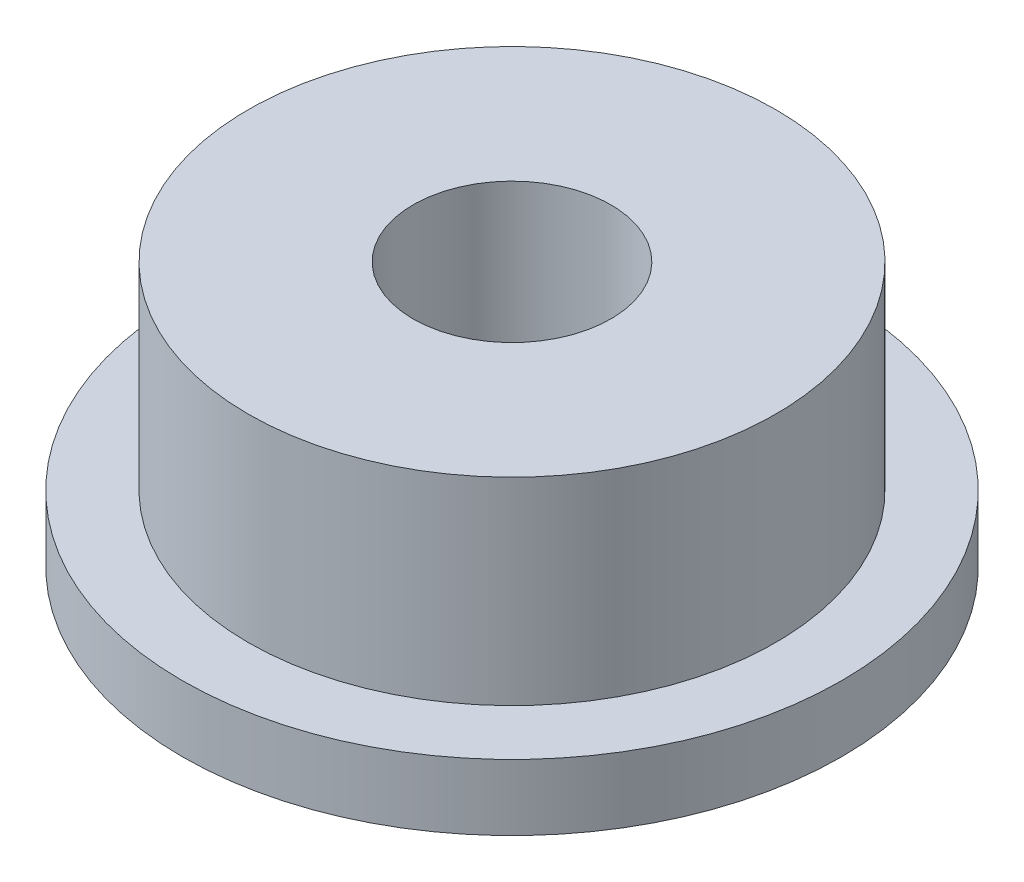
ISO-10303-21;
HEADER;
FILE_DESCRIPTION(('STEP AP214'),'2;1');
FILE_NAME('part.step','',(''),(''),'','','');
FILE_SCHEMA(('AUTOMOTIVE_DESIGN { 1 0 10303 214 1 1 1 1 }'));
ENDSEC;
DATA;
#1=APPLICATION_CONTEXT('core data for automotive mechanical design processes');
#2=APPLICATION_PROTOCOL_DEFINITION('international standard','automotive_design',2000,#1);
#3=PRODUCT_CONTEXT('',#1,'mechanical');
#4=PRODUCT('Part','Part','',(#3));
#5=PRODUCT_RELATED_PRODUCT_CATEGORY('part','',(#4));
#6=PRODUCT_DEFINITION_FORMATION('','',#4);
#7=PRODUCT_DEFINITION_CONTEXT('part definition',#1,'design');
#8=PRODUCT_DEFINITION('design','',#6,#7);
#9=PRODUCT_DEFINITION_SHAPE('','',#8);
#10=(LENGTH_UNIT() NAMED_UNIT(*) SI_UNIT(.MILLI.,.METRE.));
#11=(NAMED_UNIT(*) PLANE_ANGLE_UNIT() SI_UNIT($,.RADIAN.));
#12=(NAMED_UNIT(*) SI_UNIT($,.STERADIAN.) SOLID_ANGLE_UNIT());
#13=UNCERTAINTY_MEASURE_WITH_UNIT(LENGTH_MEASURE(1.E-05),#10,'distance_accuracy_value','');
#14=(GEOMETRIC_REPRESENTATION_CONTEXT(3) GLOBAL_UNCERTAINTY_ASSIGNED_CONTEXT((#13)) GLOBAL_UNIT_ASSIGNED_CONTEXT((#10,
#11,#12)) REPRESENTATION_CONTEXT('',''));
#15=CARTESIAN_POINT('',(0.,0.,0.));
#16=DIRECTION('',(0.,0.,1.));
#17=DIRECTION('',(1.,0.,0.));
#18=AXIS2_PLACEMENT_3D('',#15,#16,#17);
#19=CARTESIAN_POINT('',(1.5,0.,0.));
#20=DIRECTION('',(0.,-1.,0.));
#21=DIRECTION('',(0.,0.,-1.));
#22=AXIS2_PLACEMENT_3D('',#19,#20,#21);
#23=PLANE('',#22);
#24=CARTESIAN_POINT('',(0.,0.,0.));
#25=DIRECTION('',(0.,1.,0.));
#26=DIRECTION('',(0.,0.,1.));
#27=AXIS2_PLACEMENT_3D('',#24,#25,#26);
#28=CIRCLE('',#27,1.5);
#29=CARTESIAN_POINT('',(0.,0.,1.5));
#30=VERTEX_POINT('',#29);
#31=EDGE_CURVE('E54',#30,#30,#28,.T.);
#32=ORIENTED_EDGE('',*,*,#31,.F.);
#33=EDGE_LOOP('',(#32));
#34=FACE_BOUND('',#33,.T.);
#35=CARTESIAN_POINT('',(0.,0.,0.));
#36=DIRECTION('',(0.,1.,0.));
#37=DIRECTION('',(0.,0.,1.));
#38=AXIS2_PLACEMENT_3D('',#35,#36,#37);
#39=CIRCLE('',#38,4.);
#40=CARTESIAN_POINT('',(0.,0.,4.));
#41=VERTEX_POINT('',#40);
#42=EDGE_CURVE('E10',#41,#41,#39,.T.);
#43=ORIENTED_EDGE('',*,*,#42,.T.);
#44=EDGE_LOOP('',(#43));
#45=FACE_BOUND('',#44,.T.);
#46=ADVANCED_FACE('F32',(#34,#45),#23,.F.);
#47=CARTESIAN_POINT('',(0.,0.,0.));
#48=DIRECTION('',(0.,1.,0.));
#49=DIRECTION('',(0.,0.,1.));
#50=AXIS2_PLACEMENT_3D('',#47,#48,#49);
#51=CYLINDRICAL_SURFACE('',#50,4.);
#52=ORIENTED_EDGE('',*,*,#42,.F.);
#53=EDGE_LOOP('',(#52));
#54=FACE_BOUND('',#53,.T.);
#55=CARTESIAN_POINT('',(0.,-3.,0.));
#56=DIRECTION('',(0.,1.,0.));
#57=DIRECTION('',(0.,0.,1.));
#58=AXIS2_PLACEMENT_3D('',#55,#56,#57);
#59=CIRCLE('',#58,4.);
#60=CARTESIAN_POINT('',(0.,-3.,4.));
#61=VERTEX_POINT('',#60);
#62=EDGE_CURVE('E38',#61,#61,#59,.T.);
#63=ORIENTED_EDGE('',*,*,#62,.T.);
#64=EDGE_LOOP('',(#63));
#65=FACE_BOUND('',#64,.T.);
#66=ADVANCED_FACE('F61',(#54,#65),#51,.T.);
#67=CARTESIAN_POINT('',(4.,-3.,0.));
#68=DIRECTION('',(0.,-1.,0.));
#69=DIRECTION('',(0.,0.,-1.));
#70=AXIS2_PLACEMENT_3D('',#67,#68,#69);
#71=PLANE('',#70);
#72=ORIENTED_EDGE('',*,*,#62,.F.);
#73=EDGE_LOOP('',(#72));
#74=FACE_BOUND('',#73,.T.);
#75=CARTESIAN_POINT('',(0.,-3.,0.));
#76=DIRECTION('',(0.,1.,0.));
#77=DIRECTION('',(0.,0.,1.));
#78=AXIS2_PLACEMENT_3D('',#75,#76,#77);
#79=CIRCLE('',#78,5.);
#80=CARTESIAN_POINT('',(0.,-3.,5.));
#81=VERTEX_POINT('',#80);
#82=EDGE_CURVE('E42',#81,#81,#79,.T.);
#83=ORIENTED_EDGE('',*,*,#82,.T.);
#84=EDGE_LOOP('',(#83));
#85=FACE_BOUND('',#84,.T.);
#86=ADVANCED_FACE('F65',(#74,#85),#71,.F.);
#87=CARTESIAN_POINT('',(0.,0.,0.));
#88=DIRECTION('',(0.,1.,0.));
#89=DIRECTION('',(0.,0.,1.));
#90=AXIS2_PLACEMENT_3D('',#87,#88,#89);
#91=CYLINDRICAL_SURFACE('',#90,5.);
#92=ORIENTED_EDGE('',*,*,#82,.F.);
#93=EDGE_LOOP('',(#92));
#94=FACE_BOUND('',#93,.T.);
#95=CARTESIAN_POINT('',(0.,-4.,0.));
#96=DIRECTION('',(0.,1.,0.));
#97=DIRECTION('',(0.,0.,1.));
#98=AXIS2_PLACEMENT_3D('',#95,#96,#97);
#99=CIRCLE('',#98,5.);
#100=CARTESIAN_POINT('',(0.,-4.,5.));
#101=VERTEX_POINT('',#100);
#102=EDGE_CURVE('E46',#101,#101,#99,.T.);
#103=ORIENTED_EDGE('',*,*,#102,.T.);
#104=EDGE_LOOP('',(#103));
#105=FACE_BOUND('',#104,.T.);
#106=ADVANCED_FACE('F70',(#94,#105),#91,.T.);
#107=CARTESIAN_POINT('',(5.,-4.,0.));
#108=DIRECTION('',(0.,1.,0.));
#109=DIRECTION('',(0.,0.,1.));
#110=AXIS2_PLACEMENT_3D('',#107,#108,#109);
#111=PLANE('',#110);
#112=ORIENTED_EDGE('',*,*,#102,.F.);
#113=EDGE_LOOP('',(#112));
#114=FACE_BOUND('',#113,.T.);
#115=CARTESIAN_POINT('',(0.,-4.,0.));
#116=DIRECTION('',(0.,1.,0.));
#117=DIRECTION('',(0.,0.,1.));
#118=AXIS2_PLACEMENT_3D('',#115,#116,#117);
#119=CIRCLE('',#118,1.5);
#120=CARTESIAN_POINT('',(0.,-4.,1.5));
#121=VERTEX_POINT('',#120);
#122=EDGE_CURVE('E51',#121,#121,#119,.T.);
#123=ORIENTED_EDGE('',*,*,#122,.T.);
#124=EDGE_LOOP('',(#123));
#125=FACE_BOUND('',#124,.T.);
#126=ADVANCED_FACE('F76',(#114,#125),#111,.F.);
#127=CARTESIAN_POINT('',(0.,0.,0.));
#128=DIRECTION('',(0.,1.,0.));
#129=DIRECTION('',(0.,0.,1.));
#130=AXIS2_PLACEMENT_3D('',#127,#128,#129);
#131=CYLINDRICAL_SURFACE('',#130,1.5);
#132=ORIENTED_EDGE('',*,*,#122,.F.);
#133=EDGE_LOOP('',(#132));
#134=FACE_BOUND('',#133,.T.);
#135=ORIENTED_EDGE('',*,*,#31,.T.);
#136=EDGE_LOOP('',(#135));
#137=FACE_BOUND('',#136,.T.);
#138=ADVANCED_FACE('F58',(#134,#137),#131,.F.);
#139=CLOSED_SHELL('',(#46,#66,#86,#106,#126,#138));
#140=MANIFOLD_SOLID_BREP('B2',#139);
#141=ADVANCED_BREP_SHAPE_REPRESENTATION('',(#18,#140),#14);
#142=SHAPE_DEFINITION_REPRESENTATION(#9,#141);
ENDSEC;
END-ISO-10303-21;
